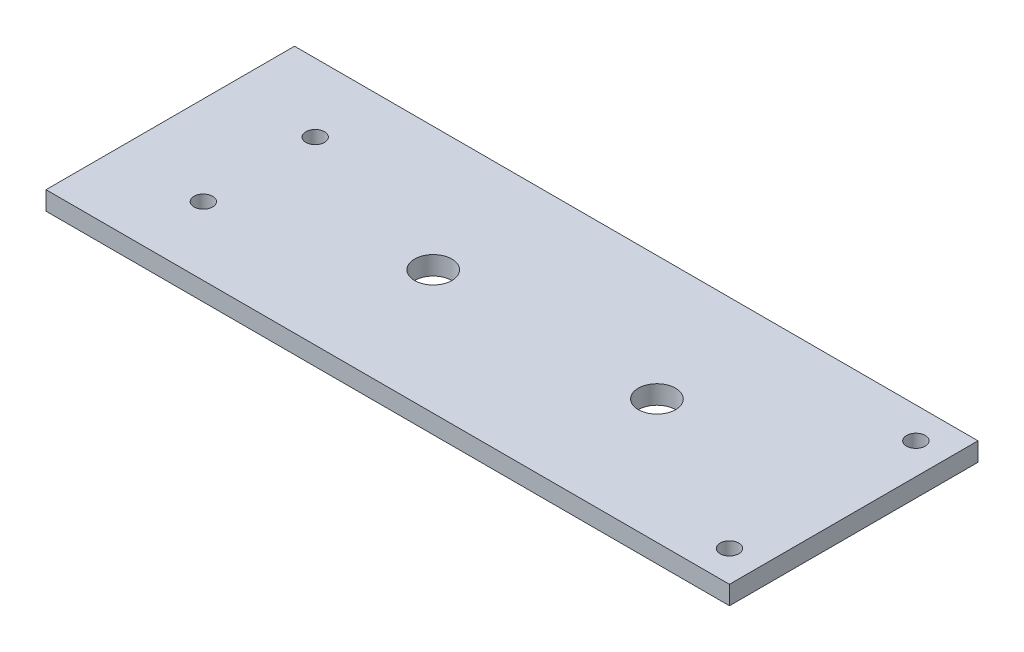
ISO-10303-21;
HEADER;
FILE_DESCRIPTION(('STEP AP214'),'2;1');
FILE_NAME('part.step','',(''),(''),'','','');
FILE_SCHEMA(('AUTOMOTIVE_DESIGN { 1 0 10303 214 1 1 1 1 }'));
ENDSEC;
DATA;
#1=APPLICATION_CONTEXT('core data for automotive mechanical design processes');
#2=APPLICATION_PROTOCOL_DEFINITION('international standard','automotive_design',2000,#1);
#3=PRODUCT_CONTEXT('',#1,'mechanical');
#4=PRODUCT('Part','Part','',(#3));
#5=PRODUCT_RELATED_PRODUCT_CATEGORY('part','',(#4));
#6=PRODUCT_DEFINITION_FORMATION('','',#4);
#7=PRODUCT_DEFINITION_CONTEXT('part definition',#1,'design');
#8=PRODUCT_DEFINITION('design','',#6,#7);
#9=PRODUCT_DEFINITION_SHAPE('','',#8);
#10=(LENGTH_UNIT() NAMED_UNIT(*) SI_UNIT(.MILLI.,.METRE.));
#11=(NAMED_UNIT(*) PLANE_ANGLE_UNIT() SI_UNIT($,.RADIAN.));
#12=(NAMED_UNIT(*) SI_UNIT($,.STERADIAN.) SOLID_ANGLE_UNIT());
#13=UNCERTAINTY_MEASURE_WITH_UNIT(LENGTH_MEASURE(1.E-05),#10,'distance_accuracy_value','');
#14=(GEOMETRIC_REPRESENTATION_CONTEXT(3) GLOBAL_UNCERTAINTY_ASSIGNED_CONTEXT((#13)) GLOBAL_UNIT_ASSIGNED_CONTEXT((#10,
#11,#12)) REPRESENTATION_CONTEXT('',''));
#15=CARTESIAN_POINT('',(0.,0.,0.));
#16=DIRECTION('',(0.,0.,1.));
#17=DIRECTION('',(1.,0.,0.));
#18=AXIS2_PLACEMENT_3D('',#15,#16,#17);
#19=CARTESIAN_POINT('',(-110.,3.,0.));
#20=DIRECTION('',(-1.,0.,0.));
#21=DIRECTION('',(0.,0.,1.));
#22=AXIS2_PLACEMENT_3D('',#19,#20,#21);
#23=PLANE('',#22);
#24=DIRECTION('',(0.,0.,-1.));
#25=VECTOR('',#24,1.);
#26=CARTESIAN_POINT('',(-110.,0.,0.));
#27=LINE('',#26,#25);
#28=CARTESIAN_POINT('',(-110.,0.,0.));
#29=VERTEX_POINT('',#28);
#30=CARTESIAN_POINT('',(-110.,0.,-40.));
#31=VERTEX_POINT('',#30);
#32=EDGE_CURVE('E120',#29,#31,#27,.T.);
#33=ORIENTED_EDGE('',*,*,#32,.F.);
#34=DIRECTION('',(0.,-1.,0.));
#35=VECTOR('',#34,1.);
#36=CARTESIAN_POINT('',(-110.,3.,0.));
#37=LINE('',#36,#35);
#38=CARTESIAN_POINT('',(-110.,3.,0.));
#39=VERTEX_POINT('',#38);
#40=EDGE_CURVE('E11',#39,#29,#37,.T.);
#41=ORIENTED_EDGE('',*,*,#40,.F.);
#42=DIRECTION('',(0.,0.,-1.));
#43=VECTOR('',#42,1.);
#44=CARTESIAN_POINT('',(-110.,3.,0.));
#45=LINE('',#44,#43);
#46=CARTESIAN_POINT('',(-110.,3.,-40.));
#47=VERTEX_POINT('',#46);
#48=EDGE_CURVE('E100',#39,#47,#45,.T.);
#49=ORIENTED_EDGE('',*,*,#48,.T.);
#50=DIRECTION('',(0.,-1.,0.));
#51=VECTOR('',#50,1.);
#52=CARTESIAN_POINT('',(-110.,3.,-40.));
#53=LINE('',#52,#51);
#54=EDGE_CURVE('E79',#47,#31,#53,.T.);
#55=ORIENTED_EDGE('',*,*,#54,.T.);
#56=EDGE_LOOP('',(#33,#41,#49,#55));
#57=FACE_BOUND('',#56,.T.);
#58=ADVANCED_FACE('F39',(#57),#23,.T.);
#59=CARTESIAN_POINT('',(0.,3.,0.));
#60=DIRECTION('',(0.,0.,1.));
#61=DIRECTION('',(1.,0.,0.));
#62=AXIS2_PLACEMENT_3D('',#59,#60,#61);
#63=PLANE('',#62);
#64=DIRECTION('',(-1.,0.,0.));
#65=VECTOR('',#64,1.);
#66=CARTESIAN_POINT('',(0.,0.,0.));
#67=LINE('',#66,#65);
#68=CARTESIAN_POINT('',(0.,0.,0.));
#69=VERTEX_POINT('',#68);
#70=EDGE_CURVE('E91',#69,#29,#67,.T.);
#71=ORIENTED_EDGE('',*,*,#70,.F.);
#72=DIRECTION('',(0.,-1.,0.));
#73=VECTOR('',#72,1.);
#74=CARTESIAN_POINT('',(0.,3.,0.));
#75=LINE('',#74,#73);
#76=CARTESIAN_POINT('',(0.,3.,0.));
#77=VERTEX_POINT('',#76);
#78=EDGE_CURVE('E48',#77,#69,#75,.T.);
#79=ORIENTED_EDGE('',*,*,#78,.F.);
#80=DIRECTION('',(-1.,0.,0.));
#81=VECTOR('',#80,1.);
#82=CARTESIAN_POINT('',(0.,3.,0.));
#83=LINE('',#82,#81);
#84=EDGE_CURVE('E89',#77,#39,#83,.T.);
#85=ORIENTED_EDGE('',*,*,#84,.T.);
#86=ORIENTED_EDGE('',*,*,#40,.T.);
#87=EDGE_LOOP('',(#71,#79,#85,#86));
#88=FACE_BOUND('',#87,.T.);
#89=ADVANCED_FACE('F87',(#88),#63,.T.);
#90=CARTESIAN_POINT('',(0.,3.,0.));
#91=DIRECTION('',(-1.,0.,0.));
#92=DIRECTION('',(0.,0.,1.));
#93=AXIS2_PLACEMENT_3D('',#90,#91,#92);
#94=PLANE('',#93);
#95=DIRECTION('',(0.,0.,-1.));
#96=VECTOR('',#95,1.);
#97=CARTESIAN_POINT('',(0.,0.,0.));
#98=LINE('',#97,#96);
#99=CARTESIAN_POINT('',(0.,0.,-40.));
#100=VERTEX_POINT('',#99);
#101=EDGE_CURVE('E123',#69,#100,#98,.T.);
#102=ORIENTED_EDGE('',*,*,#101,.T.);
#103=DIRECTION('',(0.,-1.,0.));
#104=VECTOR('',#103,1.);
#105=CARTESIAN_POINT('',(0.,3.,-40.));
#106=LINE('',#105,#104);
#107=CARTESIAN_POINT('',(0.,3.,-40.));
#108=VERTEX_POINT('',#107);
#109=EDGE_CURVE('E94',#108,#100,#106,.T.);
#110=ORIENTED_EDGE('',*,*,#109,.F.);
#111=DIRECTION('',(0.,0.,-1.));
#112=VECTOR('',#111,1.);
#113=CARTESIAN_POINT('',(0.,3.,0.));
#114=LINE('',#113,#112);
#115=EDGE_CURVE('E96',#77,#108,#114,.T.);
#116=ORIENTED_EDGE('',*,*,#115,.F.);
#117=ORIENTED_EDGE('',*,*,#78,.T.);
#118=EDGE_LOOP('',(#102,#110,#116,#117));
#119=FACE_BOUND('',#118,.T.);
#120=ADVANCED_FACE('F97',(#119),#94,.F.);
#121=CARTESIAN_POINT('',(-95.675,3.,-29.));
#122=DIRECTION('',(0.,-1.,0.));
#123=DIRECTION('',(0.,0.,-1.));
#124=AXIS2_PLACEMENT_3D('',#121,#122,#123);
#125=CYLINDRICAL_SURFACE('',#124,1.5);
#126=CARTESIAN_POINT('',(-95.675,3.,-29.));
#127=DIRECTION('',(0.,1.,0.));
#128=DIRECTION('',(0.,0.,1.));
#129=AXIS2_PLACEMENT_3D('',#126,#127,#128);
#130=CIRCLE('',#129,1.5);
#131=CARTESIAN_POINT('',(-95.675,3.,-27.5));
#132=VERTEX_POINT('',#131);
#133=EDGE_CURVE('E102',#132,#132,#130,.T.);
#134=ORIENTED_EDGE('',*,*,#133,.T.);
#135=EDGE_LOOP('',(#134));
#136=FACE_BOUND('',#135,.T.);
#137=CARTESIAN_POINT('',(-95.675,0.,-29.));
#138=DIRECTION('',(0.,1.,0.));
#139=DIRECTION('',(0.,0.,1.));
#140=AXIS2_PLACEMENT_3D('',#137,#138,#139);
#141=CIRCLE('',#140,1.5);
#142=CARTESIAN_POINT('',(-95.675,0.,-27.5));
#143=VERTEX_POINT('',#142);
#144=EDGE_CURVE('E117',#143,#143,#141,.T.);
#145=ORIENTED_EDGE('',*,*,#144,.F.);
#146=EDGE_LOOP('',(#145));
#147=FACE_BOUND('',#146,.T.);
#148=ADVANCED_FACE('F139',(#136,#147),#125,.F.);
#149=CARTESIAN_POINT('',(-95.675,3.,-11.));
#150=DIRECTION('',(0.,-1.,0.));
#151=DIRECTION('',(0.,0.,-1.));
#152=AXIS2_PLACEMENT_3D('',#149,#150,#151);
#153=CYLINDRICAL_SURFACE('',#152,1.5);
#154=CARTESIAN_POINT('',(-95.675,3.,-11.));
#155=DIRECTION('',(0.,1.,0.));
#156=DIRECTION('',(0.,0.,1.));
#157=AXIS2_PLACEMENT_3D('',#154,#155,#156);
#158=CIRCLE('',#157,1.5);
#159=CARTESIAN_POINT('',(-95.675,3.,-9.49999999999999));
#160=VERTEX_POINT('',#159);
#161=EDGE_CURVE('E259',#160,#160,#158,.T.);
#162=ORIENTED_EDGE('',*,*,#161,.T.);
#163=EDGE_LOOP('',(#162));
#164=FACE_BOUND('',#163,.T.);
#165=CARTESIAN_POINT('',(-95.675,0.,-11.));
#166=DIRECTION('',(0.,1.,0.));
#167=DIRECTION('',(0.,0.,1.));
#168=AXIS2_PLACEMENT_3D('',#165,#166,#167);
#169=CIRCLE('',#168,1.5);
#170=CARTESIAN_POINT('',(-95.675,0.,-9.49999999999999));
#171=VERTEX_POINT('',#170);
#172=EDGE_CURVE('E114',#171,#171,#169,.T.);
#173=ORIENTED_EDGE('',*,*,#172,.F.);
#174=EDGE_LOOP('',(#173));
#175=FACE_BOUND('',#174,.T.);
#176=ADVANCED_FACE('F142',(#164,#175),#153,.F.);
#177=CARTESIAN_POINT('',(-5.,3.,-35.));
#178=DIRECTION('',(0.,-1.,0.));
#179=DIRECTION('',(0.,0.,-1.));
#180=AXIS2_PLACEMENT_3D('',#177,#178,#179);
#181=CYLINDRICAL_SURFACE('',#180,1.5);
#182=CARTESIAN_POINT('',(-5.,3.,-35.));
#183=DIRECTION('',(0.,1.,0.));
#184=DIRECTION('',(0.,0.,1.));
#185=AXIS2_PLACEMENT_3D('',#182,#183,#184);
#186=CIRCLE('',#185,1.5);
#187=CARTESIAN_POINT('',(-5.,3.,-33.5));
#188=VERTEX_POINT('',#187);
#189=EDGE_CURVE('E156',#188,#188,#186,.T.);
#190=ORIENTED_EDGE('',*,*,#189,.T.);
#191=EDGE_LOOP('',(#190));
#192=FACE_BOUND('',#191,.T.);
#193=CARTESIAN_POINT('',(-5.,0.,-35.));
#194=DIRECTION('',(0.,1.,0.));
#195=DIRECTION('',(0.,0.,1.));
#196=AXIS2_PLACEMENT_3D('',#193,#194,#195);
#197=CIRCLE('',#196,1.5);
#198=CARTESIAN_POINT('',(-5.,0.,-33.5));
#199=VERTEX_POINT('',#198);
#200=EDGE_CURVE('E110',#199,#199,#197,.T.);
#201=ORIENTED_EDGE('',*,*,#200,.F.);
#202=EDGE_LOOP('',(#201));
#203=FACE_BOUND('',#202,.T.);
#204=ADVANCED_FACE('F145',(#192,#203),#181,.F.);
#205=CARTESIAN_POINT('',(-5.,3.,-5.));
#206=DIRECTION('',(0.,-1.,0.));
#207=DIRECTION('',(0.,0.,-1.));
#208=AXIS2_PLACEMENT_3D('',#205,#206,#207);
#209=CYLINDRICAL_SURFACE('',#208,1.5);
#210=CARTESIAN_POINT('',(-5.,3.,-5.));
#211=DIRECTION('',(0.,1.,0.));
#212=DIRECTION('',(0.,0.,1.));
#213=AXIS2_PLACEMENT_3D('',#210,#211,#212);
#214=CIRCLE('',#213,1.5);
#215=CARTESIAN_POINT('',(-5.,3.,-3.5));
#216=VERTEX_POINT('',#215);
#217=EDGE_CURVE('E126',#216,#216,#214,.T.);
#218=ORIENTED_EDGE('',*,*,#217,.T.);
#219=EDGE_LOOP('',(#218));
#220=FACE_BOUND('',#219,.T.);
#221=CARTESIAN_POINT('',(-5.,0.,-5.));
#222=DIRECTION('',(0.,1.,0.));
#223=DIRECTION('',(0.,0.,1.));
#224=AXIS2_PLACEMENT_3D('',#221,#222,#223);
#225=CIRCLE('',#224,1.5);
#226=CARTESIAN_POINT('',(-5.,0.,-3.5));
#227=VERTEX_POINT('',#226);
#228=EDGE_CURVE('E107',#227,#227,#225,.T.);
#229=ORIENTED_EDGE('',*,*,#228,.F.);
#230=EDGE_LOOP('',(#229));
#231=FACE_BOUND('',#230,.T.);
#232=ADVANCED_FACE('F41',(#220,#231),#209,.F.);
#233=CARTESIAN_POINT('',(0.,3.,-40.));
#234=DIRECTION('',(0.,0.,1.));
#235=DIRECTION('',(1.,0.,0.));
#236=AXIS2_PLACEMENT_3D('',#233,#234,#235);
#237=PLANE('',#236);
#238=DIRECTION('',(-1.,0.,0.));
#239=VECTOR('',#238,1.);
#240=CARTESIAN_POINT('',(0.,0.,-40.));
#241=LINE('',#240,#239);
#242=EDGE_CURVE('E72',#100,#31,#241,.T.);
#243=ORIENTED_EDGE('',*,*,#242,.T.);
#244=ORIENTED_EDGE('',*,*,#54,.F.);
#245=DIRECTION('',(-1.,0.,0.));
#246=VECTOR('',#245,1.);
#247=CARTESIAN_POINT('',(0.,3.,-40.));
#248=LINE('',#247,#246);
#249=EDGE_CURVE('E56',#108,#47,#248,.T.);
#250=ORIENTED_EDGE('',*,*,#249,.F.);
#251=ORIENTED_EDGE('',*,*,#109,.T.);
#252=EDGE_LOOP('',(#243,#244,#250,#251));
#253=FACE_BOUND('',#252,.T.);
#254=ADVANCED_FACE('F129',(#253),#237,.F.);
#255=CARTESIAN_POINT('',(0.,3.,0.));
#256=DIRECTION('',(0.,1.,0.));
#257=DIRECTION('',(0.,0.,1.));
#258=AXIS2_PLACEMENT_3D('',#255,#256,#257);
#259=PLANE('',#258);
#260=CARTESIAN_POINT('',(-67.675,3.,-20.));
#261=DIRECTION('',(0.,1.,0.));
#262=DIRECTION('',(0.,0.,1.));
#263=AXIS2_PLACEMENT_3D('',#260,#261,#262);
#264=CIRCLE('',#263,3.00000000000001);
#265=CARTESIAN_POINT('',(-67.675,3.,-17.));
#266=VERTEX_POINT('',#265);
#267=EDGE_CURVE('E245',#266,#266,#264,.F.);
#268=ORIENTED_EDGE('',*,*,#267,.T.);
#269=EDGE_LOOP('',(#268));
#270=FACE_BOUND('',#269,.T.);
#271=CARTESIAN_POINT('',(-31.675,3.,-20.));
#272=DIRECTION('',(0.,1.,0.));
#273=DIRECTION('',(0.,0.,1.));
#274=AXIS2_PLACEMENT_3D('',#271,#272,#273);
#275=CIRCLE('',#274,3.00000000000001);
#276=CARTESIAN_POINT('',(-31.675,3.,-17.));
#277=VERTEX_POINT('',#276);
#278=EDGE_CURVE('E111',#277,#277,#275,.F.);
#279=ORIENTED_EDGE('',*,*,#278,.T.);
#280=EDGE_LOOP('',(#279));
#281=FACE_BOUND('',#280,.T.);
#282=ORIENTED_EDGE('',*,*,#217,.F.);
#283=EDGE_LOOP('',(#282));
#284=FACE_BOUND('',#283,.T.);
#285=ORIENTED_EDGE('',*,*,#189,.F.);
#286=EDGE_LOOP('',(#285));
#287=FACE_BOUND('',#286,.T.);
#288=ORIENTED_EDGE('',*,*,#161,.F.);
#289=EDGE_LOOP('',(#288));
#290=FACE_BOUND('',#289,.T.);
#291=ORIENTED_EDGE('',*,*,#133,.F.);
#292=EDGE_LOOP('',(#291));
#293=FACE_BOUND('',#292,.T.);
#294=ORIENTED_EDGE('',*,*,#48,.F.);
#295=ORIENTED_EDGE('',*,*,#84,.F.);
#296=ORIENTED_EDGE('',*,*,#115,.T.);
#297=ORIENTED_EDGE('',*,*,#249,.T.);
#298=EDGE_LOOP('',(#294,#295,#296,#297));
#299=FACE_BOUND('',#298,.T.);
#300=ADVANCED_FACE('F99',(#270,#281,#284,#287,#290,#293,#299),#259,.T.);
#301=CARTESIAN_POINT('',(0.,0.,0.));
#302=DIRECTION('',(0.,1.,0.));
#303=DIRECTION('',(0.,0.,1.));
#304=AXIS2_PLACEMENT_3D('',#301,#302,#303);
#305=PLANE('',#304);
#306=CARTESIAN_POINT('',(-67.675,0.,-20.));
#307=DIRECTION('',(0.,1.,0.));
#308=DIRECTION('',(0.,0.,1.));
#309=AXIS2_PLACEMENT_3D('',#306,#307,#308);
#310=CIRCLE('',#309,3.00000000000001);
#311=CARTESIAN_POINT('',(-67.675,0.,-17.));
#312=VERTEX_POINT('',#311);
#313=EDGE_CURVE('E247',#312,#312,#310,.T.);
#314=ORIENTED_EDGE('',*,*,#313,.T.);
#315=EDGE_LOOP('',(#314));
#316=FACE_BOUND('',#315,.T.);
#317=CARTESIAN_POINT('',(-31.675,0.,-20.));
#318=DIRECTION('',(0.,1.,0.));
#319=DIRECTION('',(0.,0.,1.));
#320=AXIS2_PLACEMENT_3D('',#317,#318,#319);
#321=CIRCLE('',#320,3.00000000000001);
#322=CARTESIAN_POINT('',(-31.675,0.,-17.));
#323=VERTEX_POINT('',#322);
#324=EDGE_CURVE('E249',#323,#323,#321,.T.);
#325=ORIENTED_EDGE('',*,*,#324,.T.);
#326=EDGE_LOOP('',(#325));
#327=FACE_BOUND('',#326,.T.);
#328=ORIENTED_EDGE('',*,*,#228,.T.);
#329=EDGE_LOOP('',(#328));
#330=FACE_BOUND('',#329,.T.);
#331=ORIENTED_EDGE('',*,*,#200,.T.);
#332=EDGE_LOOP('',(#331));
#333=FACE_BOUND('',#332,.T.);
#334=ORIENTED_EDGE('',*,*,#172,.T.);
#335=EDGE_LOOP('',(#334));
#336=FACE_BOUND('',#335,.T.);
#337=ORIENTED_EDGE('',*,*,#144,.T.);
#338=EDGE_LOOP('',(#337));
#339=FACE_BOUND('',#338,.T.);
#340=ORIENTED_EDGE('',*,*,#32,.T.);
#341=ORIENTED_EDGE('',*,*,#242,.F.);
#342=ORIENTED_EDGE('',*,*,#101,.F.);
#343=ORIENTED_EDGE('',*,*,#70,.T.);
#344=EDGE_LOOP('',(#340,#341,#342,#343));
#345=FACE_BOUND('',#344,.T.);
#346=ADVANCED_FACE('F130',(#316,#327,#330,#333,#336,#339,#345),#305,.F.);
#347=CARTESIAN_POINT('',(-31.675,16.,-20.));
#348=DIRECTION('',(0.,-1.,0.));
#349=DIRECTION('',(0.,0.,-1.));
#350=AXIS2_PLACEMENT_3D('',#347,#348,#349);
#351=CYLINDRICAL_SURFACE('',#350,3.00000000000001);
#352=ORIENTED_EDGE('',*,*,#278,.F.);
#353=EDGE_LOOP('',(#352));
#354=FACE_BOUND('',#353,.T.);
#355=ORIENTED_EDGE('',*,*,#324,.F.);
#356=EDGE_LOOP('',(#355));
#357=FACE_BOUND('',#356,.T.);
#358=ADVANCED_FACE('F161',(#354,#357),#351,.F.);
#359=CARTESIAN_POINT('',(-67.675,16.,-20.));
#360=DIRECTION('',(0.,-1.,0.));
#361=DIRECTION('',(0.,0.,-1.));
#362=AXIS2_PLACEMENT_3D('',#359,#360,#361);
#363=CYLINDRICAL_SURFACE('',#362,3.00000000000001);
#364=ORIENTED_EDGE('',*,*,#267,.F.);
#365=EDGE_LOOP('',(#364));
#366=FACE_BOUND('',#365,.T.);
#367=ORIENTED_EDGE('',*,*,#313,.F.);
#368=EDGE_LOOP('',(#367));
#369=FACE_BOUND('',#368,.T.);
#370=ADVANCED_FACE('F173',(#366,#369),#363,.F.);
#371=CLOSED_SHELL('',(#58,#89,#120,#148,#176,#204,#232,#254,#300,#346,#358,#370));
#372=MANIFOLD_SOLID_BREP('B2',#371);
#373=ADVANCED_BREP_SHAPE_REPRESENTATION('',(#18,#372),#14);
#374=SHAPE_DEFINITION_REPRESENTATION(#9,#373);
ENDSEC;
END-ISO-10303-21;
